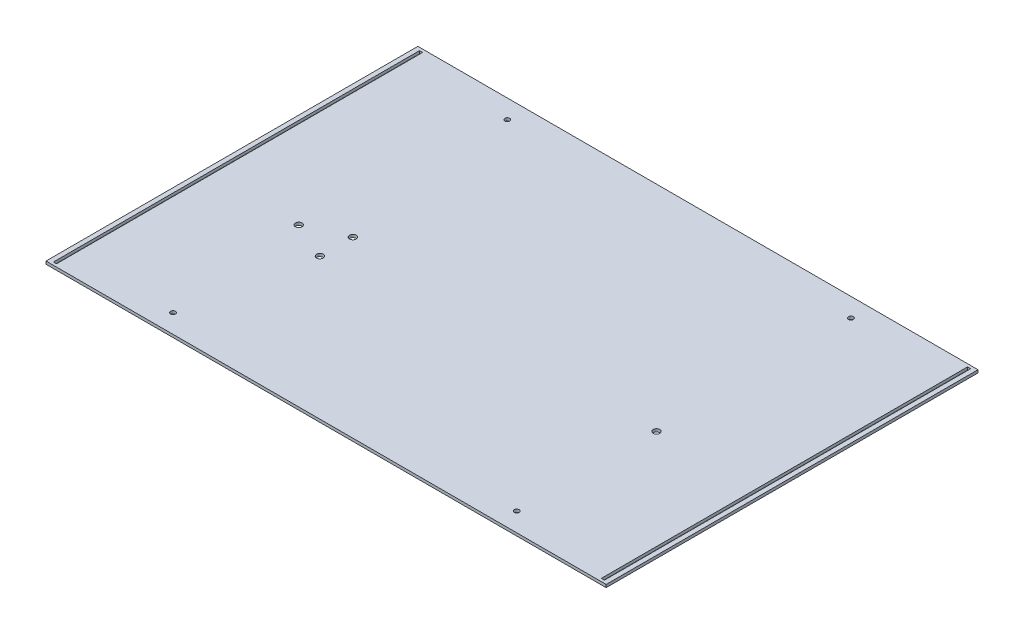
ISO-10303-21;
HEADER;
FILE_DESCRIPTION(('STEP AP214'),'2;1');
FILE_NAME('part.step','',(''),(''),'','','');
FILE_SCHEMA(('AUTOMOTIVE_DESIGN { 1 0 10303 214 1 1 1 1 }'));
ENDSEC;
DATA;
#1=APPLICATION_CONTEXT('core data for automotive mechanical design processes');
#2=APPLICATION_PROTOCOL_DEFINITION('international standard','automotive_design',2000,#1);
#3=PRODUCT_CONTEXT('',#1,'mechanical');
#4=PRODUCT('Part','Part','',(#3));
#5=PRODUCT_RELATED_PRODUCT_CATEGORY('part','',(#4));
#6=PRODUCT_DEFINITION_FORMATION('','',#4);
#7=PRODUCT_DEFINITION_CONTEXT('part definition',#1,'design');
#8=PRODUCT_DEFINITION('design','',#6,#7);
#9=PRODUCT_DEFINITION_SHAPE('','',#8);
#10=(LENGTH_UNIT() NAMED_UNIT(*) SI_UNIT(.MILLI.,.METRE.));
#11=(NAMED_UNIT(*) PLANE_ANGLE_UNIT() SI_UNIT($,.RADIAN.));
#12=(NAMED_UNIT(*) SI_UNIT($,.STERADIAN.) SOLID_ANGLE_UNIT());
#13=UNCERTAINTY_MEASURE_WITH_UNIT(LENGTH_MEASURE(1.E-05),#10,'distance_accuracy_value','');
#14=(GEOMETRIC_REPRESENTATION_CONTEXT(3) GLOBAL_UNCERTAINTY_ASSIGNED_CONTEXT((#13)) GLOBAL_UNIT_ASSIGNED_CONTEXT((#10,
#11,#12)) REPRESENTATION_CONTEXT('',''));
#15=CARTESIAN_POINT('',(0.,0.,0.));
#16=DIRECTION('',(0.,0.,1.));
#17=DIRECTION('',(1.,0.,0.));
#18=AXIS2_PLACEMENT_3D('',#15,#16,#17);
#19=CARTESIAN_POINT('',(297.5,3.,-197.5));
#20=DIRECTION('',(-1.,0.,0.));
#21=DIRECTION('',(0.,0.,1.));
#22=AXIS2_PLACEMENT_3D('',#19,#20,#21);
#23=PLANE('',#22);
#24=DIRECTION('',(0.,0.,-1.));
#25=VECTOR('',#24,1.);
#26=CARTESIAN_POINT('',(297.5,0.,-197.5));
#27=LINE('',#26,#25);
#28=CARTESIAN_POINT('',(297.5,0.,197.5));
#29=VERTEX_POINT('',#28);
#30=CARTESIAN_POINT('',(297.5,0.,-197.5));
#31=VERTEX_POINT('',#30);
#32=EDGE_CURVE('E224',#29,#31,#27,.T.);
#33=ORIENTED_EDGE('',*,*,#32,.T.);
#34=DIRECTION('',(0.,-1.,0.));
#35=VECTOR('',#34,1.);
#36=CARTESIAN_POINT('',(297.5,3.,-197.5));
#37=LINE('',#36,#35);
#38=CARTESIAN_POINT('',(297.5,3.,-197.5));
#39=VERTEX_POINT('',#38);
#40=EDGE_CURVE('E11',#39,#31,#37,.T.);
#41=ORIENTED_EDGE('',*,*,#40,.F.);
#42=DIRECTION('',(0.,0.,-1.));
#43=VECTOR('',#42,1.);
#44=CARTESIAN_POINT('',(297.5,3.,-197.5));
#45=LINE('',#44,#43);
#46=CARTESIAN_POINT('',(297.5,3.,197.5));
#47=VERTEX_POINT('',#46);
#48=EDGE_CURVE('E225',#47,#39,#45,.T.);
#49=ORIENTED_EDGE('',*,*,#48,.F.);
#50=DIRECTION('',(0.,-1.,0.));
#51=VECTOR('',#50,1.);
#52=CARTESIAN_POINT('',(297.5,3.,197.5));
#53=LINE('',#52,#51);
#54=EDGE_CURVE('E235',#47,#29,#53,.T.);
#55=ORIENTED_EDGE('',*,*,#54,.T.);
#56=EDGE_LOOP('',(#33,#41,#49,#55));
#57=FACE_BOUND('',#56,.T.);
#58=ADVANCED_FACE('F38',(#57),#23,.F.);
#59=CARTESIAN_POINT('',(-297.5,3.,-197.5));
#60=DIRECTION('',(0.,0.,1.));
#61=DIRECTION('',(1.,0.,0.));
#62=AXIS2_PLACEMENT_3D('',#59,#60,#61);
#63=PLANE('',#62);
#64=DIRECTION('',(-1.,0.,0.));
#65=VECTOR('',#64,1.);
#66=CARTESIAN_POINT('',(-297.5,0.,-197.5));
#67=LINE('',#66,#65);
#68=CARTESIAN_POINT('',(-297.5,0.,-197.5));
#69=VERTEX_POINT('',#68);
#70=EDGE_CURVE('E238',#31,#69,#67,.T.);
#71=ORIENTED_EDGE('',*,*,#70,.T.);
#72=DIRECTION('',(0.,-1.,0.));
#73=VECTOR('',#72,1.);
#74=CARTESIAN_POINT('',(-297.5,3.,-197.5));
#75=LINE('',#74,#73);
#76=CARTESIAN_POINT('',(-297.5,3.,-197.5));
#77=VERTEX_POINT('',#76);
#78=EDGE_CURVE('E46',#77,#69,#75,.T.);
#79=ORIENTED_EDGE('',*,*,#78,.F.);
#80=DIRECTION('',(-1.,0.,0.));
#81=VECTOR('',#80,1.);
#82=CARTESIAN_POINT('',(-297.5,3.,-197.5));
#83=LINE('',#82,#81);
#84=EDGE_CURVE('E228',#39,#77,#83,.T.);
#85=ORIENTED_EDGE('',*,*,#84,.F.);
#86=ORIENTED_EDGE('',*,*,#40,.T.);
#87=EDGE_LOOP('',(#71,#79,#85,#86));
#88=FACE_BOUND('',#87,.T.);
#89=ADVANCED_FACE('F277',(#88),#63,.F.);
#90=CARTESIAN_POINT('',(-297.5,3.,-197.5));
#91=DIRECTION('',(1.,0.,0.));
#92=DIRECTION('',(0.,0.,-1.));
#93=AXIS2_PLACEMENT_3D('',#90,#91,#92);
#94=PLANE('',#93);
#95=DIRECTION('',(0.,0.,1.));
#96=VECTOR('',#95,1.);
#97=CARTESIAN_POINT('',(-297.5,0.,-197.5));
#98=LINE('',#97,#96);
#99=CARTESIAN_POINT('',(-297.5,0.,197.5));
#100=VERTEX_POINT('',#99);
#101=EDGE_CURVE('E240',#69,#100,#98,.T.);
#102=ORIENTED_EDGE('',*,*,#101,.T.);
#103=DIRECTION('',(0.,-1.,0.));
#104=VECTOR('',#103,1.);
#105=CARTESIAN_POINT('',(-297.5,3.,197.5));
#106=LINE('',#105,#104);
#107=CARTESIAN_POINT('',(-297.5,3.,197.5));
#108=VERTEX_POINT('',#107);
#109=EDGE_CURVE('E245',#108,#100,#106,.T.);
#110=ORIENTED_EDGE('',*,*,#109,.F.);
#111=DIRECTION('',(0.,0.,1.));
#112=VECTOR('',#111,1.);
#113=CARTESIAN_POINT('',(-297.5,3.,-197.5));
#114=LINE('',#113,#112);
#115=EDGE_CURVE('E231',#77,#108,#114,.T.);
#116=ORIENTED_EDGE('',*,*,#115,.F.);
#117=ORIENTED_EDGE('',*,*,#78,.T.);
#118=EDGE_LOOP('',(#102,#110,#116,#117));
#119=FACE_BOUND('',#118,.T.);
#120=ADVANCED_FACE('F282',(#119),#94,.F.);
#121=CARTESIAN_POINT('',(-297.5,3.,197.5));
#122=DIRECTION('',(0.,0.,-1.));
#123=DIRECTION('',(-1.,0.,0.));
#124=AXIS2_PLACEMENT_3D('',#121,#122,#123);
#125=PLANE('',#124);
#126=DIRECTION('',(1.,0.,0.));
#127=VECTOR('',#126,1.);
#128=CARTESIAN_POINT('',(-297.5,0.,197.5));
#129=LINE('',#128,#127);
#130=EDGE_CURVE('E229',#100,#29,#129,.T.);
#131=ORIENTED_EDGE('',*,*,#130,.T.);
#132=ORIENTED_EDGE('',*,*,#54,.F.);
#133=DIRECTION('',(1.,0.,0.));
#134=VECTOR('',#133,1.);
#135=CARTESIAN_POINT('',(-297.5,3.,197.5));
#136=LINE('',#135,#134);
#137=EDGE_CURVE('E233',#108,#47,#136,.T.);
#138=ORIENTED_EDGE('',*,*,#137,.F.);
#139=ORIENTED_EDGE('',*,*,#109,.T.);
#140=EDGE_LOOP('',(#131,#132,#138,#139));
#141=FACE_BOUND('',#140,.T.);
#142=ADVANCED_FACE('F298',(#141),#125,.F.);
#143=CARTESIAN_POINT('',(0.,3.,0.));
#144=DIRECTION('',(0.,1.,0.));
#145=DIRECTION('',(0.,0.,1.));
#146=AXIS2_PLACEMENT_3D('',#143,#144,#145);
#147=PLANE('',#146);
#148=CARTESIAN_POINT('',(182.5,3.,-177.5));
#149=DIRECTION('',(0.,-1.,0.));
#150=DIRECTION('',(0.,0.,-1.));
#151=AXIS2_PLACEMENT_3D('',#148,#149,#150);
#152=CIRCLE('',#151,2.59999999999999);
#153=CARTESIAN_POINT('',(182.5,3.,-180.1));
#154=VERTEX_POINT('',#153);
#155=EDGE_CURVE('E375',#154,#154,#152,.T.);
#156=ORIENTED_EDGE('',*,*,#155,.T.);
#157=EDGE_LOOP('',(#156));
#158=FACE_BOUND('',#157,.T.);
#159=CARTESIAN_POINT('',(-182.5,3.,-177.5));
#160=DIRECTION('',(0.,-1.,0.));
#161=DIRECTION('',(0.,0.,-1.));
#162=AXIS2_PLACEMENT_3D('',#159,#160,#161);
#163=CIRCLE('',#162,2.59999999999999);
#164=CARTESIAN_POINT('',(-182.5,3.,-180.1));
#165=VERTEX_POINT('',#164);
#166=EDGE_CURVE('E370',#165,#165,#163,.T.);
#167=ORIENTED_EDGE('',*,*,#166,.T.);
#168=EDGE_LOOP('',(#167));
#169=FACE_BOUND('',#168,.T.);
#170=CARTESIAN_POINT('',(-182.5,3.,177.5));
#171=DIRECTION('',(0.,-1.,0.));
#172=DIRECTION('',(0.,0.,-1.));
#173=AXIS2_PLACEMENT_3D('',#170,#171,#172);
#174=CIRCLE('',#173,2.59999999999999);
#175=CARTESIAN_POINT('',(-182.5,3.,174.9));
#176=VERTEX_POINT('',#175);
#177=EDGE_CURVE('E368',#176,#176,#174,.T.);
#178=ORIENTED_EDGE('',*,*,#177,.T.);
#179=EDGE_LOOP('',(#178));
#180=FACE_BOUND('',#179,.T.);
#181=CARTESIAN_POINT('',(182.5,3.,177.5));
#182=DIRECTION('',(0.,-1.,0.));
#183=DIRECTION('',(0.,0.,-1.));
#184=AXIS2_PLACEMENT_3D('',#181,#182,#183);
#185=CIRCLE('',#184,2.59999999999999);
#186=CARTESIAN_POINT('',(182.5,3.,174.9));
#187=VERTEX_POINT('',#186);
#188=EDGE_CURVE('E156',#187,#187,#185,.T.);
#189=ORIENTED_EDGE('',*,*,#188,.T.);
#190=EDGE_LOOP('',(#189));
#191=FACE_BOUND('',#190,.T.);
#192=DIRECTION('',(0.,0.,1.));
#193=VECTOR('',#192,1.);
#194=CARTESIAN_POINT('',(289.350000000001,3.,0.));
#195=LINE('',#194,#193);
#196=CARTESIAN_POINT('',(289.350000000001,3.,-194.499999999999));
#197=VERTEX_POINT('',#196);
#198=CARTESIAN_POINT('',(289.350000000001,3.,194.500000000001));
#199=VERTEX_POINT('',#198);
#200=EDGE_CURVE('E133',#197,#199,#195,.T.);
#201=ORIENTED_EDGE('',*,*,#200,.F.);
#202=DIRECTION('',(-1.,0.,0.));
#203=VECTOR('',#202,1.);
#204=CARTESIAN_POINT('',(0.,3.,-194.499999999999));
#205=LINE('',#204,#203);
#206=CARTESIAN_POINT('',(292.650000000001,3.,-194.499999999999));
#207=VERTEX_POINT('',#206);
#208=EDGE_CURVE('E197',#207,#197,#205,.T.);
#209=ORIENTED_EDGE('',*,*,#208,.F.);
#210=DIRECTION('',(0.,0.,-1.));
#211=VECTOR('',#210,1.);
#212=CARTESIAN_POINT('',(292.650000000001,3.,0.));
#213=LINE('',#212,#211);
#214=CARTESIAN_POINT('',(292.650000000001,3.,194.500000000001));
#215=VERTEX_POINT('',#214);
#216=EDGE_CURVE('E195',#215,#207,#213,.T.);
#217=ORIENTED_EDGE('',*,*,#216,.F.);
#218=DIRECTION('',(1.,0.,0.));
#219=VECTOR('',#218,1.);
#220=CARTESIAN_POINT('',(0.,3.,194.500000000001));
#221=LINE('',#220,#219);
#222=EDGE_CURVE('E193',#199,#215,#221,.T.);
#223=ORIENTED_EDGE('',*,*,#222,.F.);
#224=EDGE_LOOP('',(#201,#209,#217,#223));
#225=FACE_BOUND('',#224,.T.);
#226=DIRECTION('',(0.,0.,-1.));
#227=VECTOR('',#226,1.);
#228=CARTESIAN_POINT('',(-289.35,3.,0.));
#229=LINE('',#228,#227);
#230=CARTESIAN_POINT('',(-289.35,3.,194.5));
#231=VERTEX_POINT('',#230);
#232=CARTESIAN_POINT('',(-289.35,3.,-194.5));
#233=VERTEX_POINT('',#232);
#234=EDGE_CURVE('E191',#231,#233,#229,.T.);
#235=ORIENTED_EDGE('',*,*,#234,.F.);
#236=DIRECTION('',(1.,0.,0.));
#237=VECTOR('',#236,1.);
#238=CARTESIAN_POINT('',(0.,3.,194.5));
#239=LINE('',#238,#237);
#240=CARTESIAN_POINT('',(-292.65,3.,194.5));
#241=VERTEX_POINT('',#240);
#242=EDGE_CURVE('E189',#241,#231,#239,.T.);
#243=ORIENTED_EDGE('',*,*,#242,.F.);
#244=DIRECTION('',(0.,0.,1.));
#245=VECTOR('',#244,1.);
#246=CARTESIAN_POINT('',(-292.65,3.,0.));
#247=LINE('',#246,#245);
#248=CARTESIAN_POINT('',(-292.65,3.,-194.5));
#249=VERTEX_POINT('',#248);
#250=EDGE_CURVE('E187',#249,#241,#247,.T.);
#251=ORIENTED_EDGE('',*,*,#250,.F.);
#252=DIRECTION('',(-1.,0.,0.));
#253=VECTOR('',#252,1.);
#254=CARTESIAN_POINT('',(0.,3.,-194.5));
#255=LINE('',#254,#253);
#256=EDGE_CURVE('E163',#233,#249,#255,.T.);
#257=ORIENTED_EDGE('',*,*,#256,.F.);
#258=EDGE_LOOP('',(#235,#243,#251,#257));
#259=FACE_BOUND('',#258,.T.);
#260=CARTESIAN_POINT('',(-196.5,3.,30.));
#261=DIRECTION('',(0.,1.,0.));
#262=DIRECTION('',(0.,0.,1.));
#263=AXIS2_PLACEMENT_3D('',#260,#261,#262);
#264=CIRCLE('',#263,3.54999999999999);
#265=CARTESIAN_POINT('',(-196.5,3.,33.55));
#266=VERTEX_POINT('',#265);
#267=EDGE_CURVE('E221',#266,#266,#264,.T.);
#268=ORIENTED_EDGE('',*,*,#267,.F.);
#269=EDGE_LOOP('',(#268));
#270=FACE_BOUND('',#269,.T.);
#271=CARTESIAN_POINT('',(-156.5,3.,47.4999999999998));
#272=DIRECTION('',(0.,1.,0.));
#273=DIRECTION('',(0.,0.,1.));
#274=AXIS2_PLACEMENT_3D('',#271,#272,#273);
#275=CIRCLE('',#274,3.54999999999999);
#276=CARTESIAN_POINT('',(-156.5,3.,51.0499999999998));
#277=VERTEX_POINT('',#276);
#278=EDGE_CURVE('E218',#277,#277,#275,.T.);
#279=ORIENTED_EDGE('',*,*,#278,.F.);
#280=EDGE_LOOP('',(#279));
#281=FACE_BOUND('',#280,.T.);
#282=CARTESIAN_POINT('',(-156.5,3.,12.4999999999998));
#283=DIRECTION('',(0.,1.,0.));
#284=DIRECTION('',(0.,0.,1.));
#285=AXIS2_PLACEMENT_3D('',#282,#283,#284);
#286=CIRCLE('',#285,3.54999999999999);
#287=CARTESIAN_POINT('',(-156.5,3.,16.0499999999998));
#288=VERTEX_POINT('',#287);
#289=EDGE_CURVE('E215',#288,#288,#286,.T.);
#290=ORIENTED_EDGE('',*,*,#289,.F.);
#291=EDGE_LOOP('',(#290));
#292=FACE_BOUND('',#291,.T.);
#293=CARTESIAN_POINT('',(183.5,3.,30.0000000000084));
#294=DIRECTION('',(0.,1.,0.));
#295=DIRECTION('',(0.,0.,1.));
#296=AXIS2_PLACEMENT_3D('',#293,#294,#295);
#297=CIRCLE('',#296,3.54999999999999);
#298=CARTESIAN_POINT('',(183.5,3.,33.5500000000084));
#299=VERTEX_POINT('',#298);
#300=EDGE_CURVE('E204',#299,#299,#297,.T.);
#301=ORIENTED_EDGE('',*,*,#300,.F.);
#302=EDGE_LOOP('',(#301));
#303=FACE_BOUND('',#302,.T.);
#304=ORIENTED_EDGE('',*,*,#48,.T.);
#305=ORIENTED_EDGE('',*,*,#84,.T.);
#306=ORIENTED_EDGE('',*,*,#115,.T.);
#307=ORIENTED_EDGE('',*,*,#137,.T.);
#308=EDGE_LOOP('',(#304,#305,#306,#307));
#309=FACE_BOUND('',#308,.T.);
#310=ADVANCED_FACE('F294',(#158,#169,#180,#191,#225,#259,#270,#281,#292,#303,#309),#147,.T.);
#311=CARTESIAN_POINT('',(0.,0.,0.));
#312=DIRECTION('',(0.,1.,0.));
#313=DIRECTION('',(0.,0.,1.));
#314=AXIS2_PLACEMENT_3D('',#311,#312,#313);
#315=PLANE('',#314);
#316=CARTESIAN_POINT('',(182.5,0.,-177.5));
#317=DIRECTION('',(0.,1.,0.));
#318=DIRECTION('',(0.,0.,1.));
#319=AXIS2_PLACEMENT_3D('',#316,#317,#318);
#320=CIRCLE('',#319,2.59999999999999);
#321=CARTESIAN_POINT('',(182.5,0.,-174.9));
#322=VERTEX_POINT('',#321);
#323=EDGE_CURVE('E41',#322,#322,#320,.T.);
#324=ORIENTED_EDGE('',*,*,#323,.T.);
#325=EDGE_LOOP('',(#324));
#326=FACE_BOUND('',#325,.T.);
#327=CARTESIAN_POINT('',(-182.5,0.,-177.5));
#328=DIRECTION('',(0.,1.,0.));
#329=DIRECTION('',(0.,0.,1.));
#330=AXIS2_PLACEMENT_3D('',#327,#328,#329);
#331=CIRCLE('',#330,2.59999999999999);
#332=CARTESIAN_POINT('',(-182.5,0.,-174.9));
#333=VERTEX_POINT('',#332);
#334=EDGE_CURVE('E255',#333,#333,#331,.T.);
#335=ORIENTED_EDGE('',*,*,#334,.T.);
#336=EDGE_LOOP('',(#335));
#337=FACE_BOUND('',#336,.T.);
#338=CARTESIAN_POINT('',(-182.5,0.,177.5));
#339=DIRECTION('',(0.,1.,0.));
#340=DIRECTION('',(0.,0.,1.));
#341=AXIS2_PLACEMENT_3D('',#338,#339,#340);
#342=CIRCLE('',#341,2.59999999999999);
#343=CARTESIAN_POINT('',(-182.5,0.,180.1));
#344=VERTEX_POINT('',#343);
#345=EDGE_CURVE('E253',#344,#344,#342,.T.);
#346=ORIENTED_EDGE('',*,*,#345,.T.);
#347=EDGE_LOOP('',(#346));
#348=FACE_BOUND('',#347,.T.);
#349=CARTESIAN_POINT('',(182.5,0.,177.5));
#350=DIRECTION('',(0.,1.,0.));
#351=DIRECTION('',(0.,0.,1.));
#352=AXIS2_PLACEMENT_3D('',#349,#350,#351);
#353=CIRCLE('',#352,2.59999999999999);
#354=CARTESIAN_POINT('',(182.5,0.,180.1));
#355=VERTEX_POINT('',#354);
#356=EDGE_CURVE('E250',#355,#355,#353,.T.);
#357=ORIENTED_EDGE('',*,*,#356,.T.);
#358=EDGE_LOOP('',(#357));
#359=FACE_BOUND('',#358,.T.);
#360=DIRECTION('',(-1.,0.,0.));
#361=VECTOR('',#360,1.);
#362=CARTESIAN_POINT('',(292.650000000001,0.,-194.499999999999));
#363=LINE('',#362,#361);
#364=CARTESIAN_POINT('',(292.650000000001,0.,-194.499999999999));
#365=VERTEX_POINT('',#364);
#366=CARTESIAN_POINT('',(289.350000000001,0.,-194.499999999999));
#367=VERTEX_POINT('',#366);
#368=EDGE_CURVE('E136',#365,#367,#363,.T.);
#369=ORIENTED_EDGE('',*,*,#368,.T.);
#370=DIRECTION('',(0.,0.,1.));
#371=VECTOR('',#370,1.);
#372=CARTESIAN_POINT('',(289.350000000001,0.,194.500000000001));
#373=LINE('',#372,#371);
#374=CARTESIAN_POINT('',(289.350000000001,0.,194.500000000001));
#375=VERTEX_POINT('',#374);
#376=EDGE_CURVE('E130',#367,#375,#373,.T.);
#377=ORIENTED_EDGE('',*,*,#376,.T.);
#378=DIRECTION('',(1.,0.,0.));
#379=VECTOR('',#378,1.);
#380=CARTESIAN_POINT('',(292.650000000001,0.,194.500000000001));
#381=LINE('',#380,#379);
#382=CARTESIAN_POINT('',(292.650000000001,0.,194.500000000001));
#383=VERTEX_POINT('',#382);
#384=EDGE_CURVE('E140',#375,#383,#381,.T.);
#385=ORIENTED_EDGE('',*,*,#384,.T.);
#386=DIRECTION('',(0.,0.,-1.));
#387=VECTOR('',#386,1.);
#388=CARTESIAN_POINT('',(292.650000000001,0.,194.500000000001));
#389=LINE('',#388,#387);
#390=EDGE_CURVE('E145',#383,#365,#389,.T.);
#391=ORIENTED_EDGE('',*,*,#390,.T.);
#392=EDGE_LOOP('',(#369,#377,#385,#391));
#393=FACE_BOUND('',#392,.T.);
#394=DIRECTION('',(1.,0.,0.));
#395=VECTOR('',#394,1.);
#396=CARTESIAN_POINT('',(-292.65,0.,194.5));
#397=LINE('',#396,#395);
#398=CARTESIAN_POINT('',(-292.65,0.,194.5));
#399=VERTEX_POINT('',#398);
#400=CARTESIAN_POINT('',(-289.35,0.,194.5));
#401=VERTEX_POINT('',#400);
#402=EDGE_CURVE('E177',#399,#401,#397,.T.);
#403=ORIENTED_EDGE('',*,*,#402,.T.);
#404=DIRECTION('',(0.,0.,-1.));
#405=VECTOR('',#404,1.);
#406=CARTESIAN_POINT('',(-289.35,0.,194.5));
#407=LINE('',#406,#405);
#408=CARTESIAN_POINT('',(-289.35,0.,-194.5));
#409=VERTEX_POINT('',#408);
#410=EDGE_CURVE('E168',#401,#409,#407,.T.);
#411=ORIENTED_EDGE('',*,*,#410,.T.);
#412=DIRECTION('',(-1.,0.,0.));
#413=VECTOR('',#412,1.);
#414=CARTESIAN_POINT('',(-292.65,0.,-194.5));
#415=LINE('',#414,#413);
#416=CARTESIAN_POINT('',(-292.65,0.,-194.5));
#417=VERTEX_POINT('',#416);
#418=EDGE_CURVE('E171',#409,#417,#415,.T.);
#419=ORIENTED_EDGE('',*,*,#418,.T.);
#420=DIRECTION('',(0.,0.,1.));
#421=VECTOR('',#420,1.);
#422=CARTESIAN_POINT('',(-292.65,0.,194.5));
#423=LINE('',#422,#421);
#424=EDGE_CURVE('E174',#417,#399,#423,.T.);
#425=ORIENTED_EDGE('',*,*,#424,.T.);
#426=EDGE_LOOP('',(#403,#411,#419,#425));
#427=FACE_BOUND('',#426,.T.);
#428=CARTESIAN_POINT('',(-196.5,0.,30.));
#429=DIRECTION('',(0.,1.,0.));
#430=DIRECTION('',(0.,0.,1.));
#431=AXIS2_PLACEMENT_3D('',#428,#429,#430);
#432=CIRCLE('',#431,3.54999999999999);
#433=CARTESIAN_POINT('',(-196.5,0.,33.55));
#434=VERTEX_POINT('',#433);
#435=EDGE_CURVE('E201',#434,#434,#432,.T.);
#436=ORIENTED_EDGE('',*,*,#435,.T.);
#437=EDGE_LOOP('',(#436));
#438=FACE_BOUND('',#437,.T.);
#439=CARTESIAN_POINT('',(-156.5,0.,47.4999999999998));
#440=DIRECTION('',(0.,1.,0.));
#441=DIRECTION('',(0.,0.,1.));
#442=AXIS2_PLACEMENT_3D('',#439,#440,#441);
#443=CIRCLE('',#442,3.54999999999999);
#444=CARTESIAN_POINT('',(-156.5,0.,51.0499999999998));
#445=VERTEX_POINT('',#444);
#446=EDGE_CURVE('E205',#445,#445,#443,.T.);
#447=ORIENTED_EDGE('',*,*,#446,.T.);
#448=EDGE_LOOP('',(#447));
#449=FACE_BOUND('',#448,.T.);
#450=CARTESIAN_POINT('',(-156.5,0.,12.4999999999998));
#451=DIRECTION('',(0.,1.,0.));
#452=DIRECTION('',(0.,0.,1.));
#453=AXIS2_PLACEMENT_3D('',#450,#451,#452);
#454=CIRCLE('',#453,3.54999999999999);
#455=CARTESIAN_POINT('',(-156.5,0.,16.0499999999998));
#456=VERTEX_POINT('',#455);
#457=EDGE_CURVE('E208',#456,#456,#454,.T.);
#458=ORIENTED_EDGE('',*,*,#457,.T.);
#459=EDGE_LOOP('',(#458));
#460=FACE_BOUND('',#459,.T.);
#461=CARTESIAN_POINT('',(183.5,0.,30.0000000000084));
#462=DIRECTION('',(0.,1.,0.));
#463=DIRECTION('',(0.,0.,1.));
#464=AXIS2_PLACEMENT_3D('',#461,#462,#463);
#465=CIRCLE('',#464,3.54999999999999);
#466=CARTESIAN_POINT('',(183.5,0.,33.5500000000084));
#467=VERTEX_POINT('',#466);
#468=EDGE_CURVE('E200',#467,#467,#465,.T.);
#469=ORIENTED_EDGE('',*,*,#468,.T.);
#470=EDGE_LOOP('',(#469));
#471=FACE_BOUND('',#470,.T.);
#472=ORIENTED_EDGE('',*,*,#32,.F.);
#473=ORIENTED_EDGE('',*,*,#130,.F.);
#474=ORIENTED_EDGE('',*,*,#101,.F.);
#475=ORIENTED_EDGE('',*,*,#70,.F.);
#476=EDGE_LOOP('',(#472,#473,#474,#475));
#477=FACE_BOUND('',#476,.T.);
#478=ADVANCED_FACE('F147',(#326,#337,#348,#359,#393,#427,#438,#449,#460,#471,#477),#315,.F.);
#479=CARTESIAN_POINT('',(183.5,0.,30.0000000000084));
#480=DIRECTION('',(0.,1.,0.));
#481=DIRECTION('',(0.,0.,1.));
#482=AXIS2_PLACEMENT_3D('',#479,#480,#481);
#483=CYLINDRICAL_SURFACE('',#482,3.54999999999999);
#484=ORIENTED_EDGE('',*,*,#300,.T.);
#485=EDGE_LOOP('',(#484));
#486=FACE_BOUND('',#485,.T.);
#487=ORIENTED_EDGE('',*,*,#468,.F.);
#488=EDGE_LOOP('',(#487));
#489=FACE_BOUND('',#488,.T.);
#490=ADVANCED_FACE('F309',(#486,#489),#483,.F.);
#491=CARTESIAN_POINT('',(-156.5,0.,12.4999999999998));
#492=DIRECTION('',(0.,1.,0.));
#493=DIRECTION('',(0.,0.,1.));
#494=AXIS2_PLACEMENT_3D('',#491,#492,#493);
#495=CYLINDRICAL_SURFACE('',#494,3.54999999999999);
#496=ORIENTED_EDGE('',*,*,#289,.T.);
#497=EDGE_LOOP('',(#496));
#498=FACE_BOUND('',#497,.T.);
#499=ORIENTED_EDGE('',*,*,#457,.F.);
#500=EDGE_LOOP('',(#499));
#501=FACE_BOUND('',#500,.T.);
#502=ADVANCED_FACE('F315',(#498,#501),#495,.F.);
#503=CARTESIAN_POINT('',(-156.5,0.,47.4999999999998));
#504=DIRECTION('',(0.,1.,0.));
#505=DIRECTION('',(0.,0.,1.));
#506=AXIS2_PLACEMENT_3D('',#503,#504,#505);
#507=CYLINDRICAL_SURFACE('',#506,3.54999999999999);
#508=ORIENTED_EDGE('',*,*,#278,.T.);
#509=EDGE_LOOP('',(#508));
#510=FACE_BOUND('',#509,.T.);
#511=ORIENTED_EDGE('',*,*,#446,.F.);
#512=EDGE_LOOP('',(#511));
#513=FACE_BOUND('',#512,.T.);
#514=ADVANCED_FACE('F319',(#510,#513),#507,.F.);
#515=CARTESIAN_POINT('',(-196.5,0.,30.));
#516=DIRECTION('',(0.,1.,0.));
#517=DIRECTION('',(0.,0.,1.));
#518=AXIS2_PLACEMENT_3D('',#515,#516,#517);
#519=CYLINDRICAL_SURFACE('',#518,3.54999999999999);
#520=ORIENTED_EDGE('',*,*,#267,.T.);
#521=EDGE_LOOP('',(#520));
#522=FACE_BOUND('',#521,.T.);
#523=ORIENTED_EDGE('',*,*,#435,.F.);
#524=EDGE_LOOP('',(#523));
#525=FACE_BOUND('',#524,.T.);
#526=ADVANCED_FACE('F323',(#522,#525),#519,.F.);
#527=CARTESIAN_POINT('',(-289.35,0.,194.5));
#528=DIRECTION('',(1.,0.,0.));
#529=DIRECTION('',(0.,0.,-1.));
#530=AXIS2_PLACEMENT_3D('',#527,#528,#529);
#531=PLANE('',#530);
#532=ORIENTED_EDGE('',*,*,#234,.T.);
#533=DIRECTION('',(0.,1.,0.));
#534=VECTOR('',#533,1.);
#535=CARTESIAN_POINT('',(-289.35,0.,-194.5));
#536=LINE('',#535,#534);
#537=EDGE_CURVE('E62',#409,#233,#536,.T.);
#538=ORIENTED_EDGE('',*,*,#537,.F.);
#539=ORIENTED_EDGE('',*,*,#410,.F.);
#540=DIRECTION('',(0.,1.,0.));
#541=VECTOR('',#540,1.);
#542=CARTESIAN_POINT('',(-289.35,0.,194.5));
#543=LINE('',#542,#541);
#544=EDGE_CURVE('E150',#401,#231,#543,.T.);
#545=ORIENTED_EDGE('',*,*,#544,.T.);
#546=EDGE_LOOP('',(#532,#538,#539,#545));
#547=FACE_BOUND('',#546,.T.);
#548=ADVANCED_FACE('F327',(#547),#531,.F.);
#549=CARTESIAN_POINT('',(-292.65,0.,194.5));
#550=DIRECTION('',(0.,0.,1.));
#551=DIRECTION('',(1.,0.,0.));
#552=AXIS2_PLACEMENT_3D('',#549,#550,#551);
#553=PLANE('',#552);
#554=ORIENTED_EDGE('',*,*,#242,.T.);
#555=ORIENTED_EDGE('',*,*,#544,.F.);
#556=ORIENTED_EDGE('',*,*,#402,.F.);
#557=DIRECTION('',(0.,1.,0.));
#558=VECTOR('',#557,1.);
#559=CARTESIAN_POINT('',(-292.65,0.,194.5));
#560=LINE('',#559,#558);
#561=EDGE_CURVE('E153',#399,#241,#560,.T.);
#562=ORIENTED_EDGE('',*,*,#561,.T.);
#563=EDGE_LOOP('',(#554,#555,#556,#562));
#564=FACE_BOUND('',#563,.T.);
#565=ADVANCED_FACE('F331',(#564),#553,.F.);
#566=CARTESIAN_POINT('',(-292.65,0.,194.5));
#567=DIRECTION('',(-1.,0.,0.));
#568=DIRECTION('',(0.,0.,1.));
#569=AXIS2_PLACEMENT_3D('',#566,#567,#568);
#570=PLANE('',#569);
#571=ORIENTED_EDGE('',*,*,#250,.T.);
#572=ORIENTED_EDGE('',*,*,#561,.F.);
#573=ORIENTED_EDGE('',*,*,#424,.F.);
#574=DIRECTION('',(0.,1.,0.));
#575=VECTOR('',#574,1.);
#576=CARTESIAN_POINT('',(-292.65,0.,-194.5));
#577=LINE('',#576,#575);
#578=EDGE_CURVE('E182',#417,#249,#577,.T.);
#579=ORIENTED_EDGE('',*,*,#578,.T.);
#580=EDGE_LOOP('',(#571,#572,#573,#579));
#581=FACE_BOUND('',#580,.T.);
#582=ADVANCED_FACE('F336',(#581),#570,.F.);
#583=CARTESIAN_POINT('',(-292.65,0.,-194.5));
#584=DIRECTION('',(0.,0.,-1.));
#585=DIRECTION('',(-1.,0.,0.));
#586=AXIS2_PLACEMENT_3D('',#583,#584,#585);
#587=PLANE('',#586);
#588=ORIENTED_EDGE('',*,*,#256,.T.);
#589=ORIENTED_EDGE('',*,*,#578,.F.);
#590=ORIENTED_EDGE('',*,*,#418,.F.);
#591=ORIENTED_EDGE('',*,*,#537,.T.);
#592=EDGE_LOOP('',(#588,#589,#590,#591));
#593=FACE_BOUND('',#592,.T.);
#594=ADVANCED_FACE('F333',(#593),#587,.F.);
#595=CARTESIAN_POINT('',(289.350000000001,0.,194.500000000001));
#596=DIRECTION('',(-1.,0.,0.));
#597=DIRECTION('',(0.,0.,1.));
#598=AXIS2_PLACEMENT_3D('',#595,#596,#597);
#599=PLANE('',#598);
#600=ORIENTED_EDGE('',*,*,#200,.T.);
#601=DIRECTION('',(0.,1.,0.));
#602=VECTOR('',#601,1.);
#603=CARTESIAN_POINT('',(289.350000000001,0.,194.500000000001));
#604=LINE('',#603,#602);
#605=EDGE_CURVE('E54',#375,#199,#604,.T.);
#606=ORIENTED_EDGE('',*,*,#605,.F.);
#607=ORIENTED_EDGE('',*,*,#376,.F.);
#608=DIRECTION('',(0.,1.,0.));
#609=VECTOR('',#608,1.);
#610=CARTESIAN_POINT('',(289.350000000001,0.,-194.499999999999));
#611=LINE('',#610,#609);
#612=EDGE_CURVE('E161',#367,#197,#611,.T.);
#613=ORIENTED_EDGE('',*,*,#612,.T.);
#614=EDGE_LOOP('',(#600,#606,#607,#613));
#615=FACE_BOUND('',#614,.T.);
#616=ADVANCED_FACE('F127',(#615),#599,.F.);
#617=CARTESIAN_POINT('',(292.650000000001,0.,-194.499999999999));
#618=DIRECTION('',(0.,0.,-1.));
#619=DIRECTION('',(-1.,0.,0.));
#620=AXIS2_PLACEMENT_3D('',#617,#618,#619);
#621=PLANE('',#620);
#622=ORIENTED_EDGE('',*,*,#208,.T.);
#623=ORIENTED_EDGE('',*,*,#612,.F.);
#624=ORIENTED_EDGE('',*,*,#368,.F.);
#625=DIRECTION('',(0.,1.,0.));
#626=VECTOR('',#625,1.);
#627=CARTESIAN_POINT('',(292.650000000001,0.,-194.499999999999));
#628=LINE('',#627,#626);
#629=EDGE_CURVE('E164',#365,#207,#628,.T.);
#630=ORIENTED_EDGE('',*,*,#629,.T.);
#631=EDGE_LOOP('',(#622,#623,#624,#630));
#632=FACE_BOUND('',#631,.T.);
#633=ADVANCED_FACE('F345',(#632),#621,.F.);
#634=CARTESIAN_POINT('',(292.650000000001,0.,194.500000000001));
#635=DIRECTION('',(1.,0.,0.));
#636=DIRECTION('',(0.,0.,-1.));
#637=AXIS2_PLACEMENT_3D('',#634,#635,#636);
#638=PLANE('',#637);
#639=ORIENTED_EDGE('',*,*,#216,.T.);
#640=ORIENTED_EDGE('',*,*,#629,.F.);
#641=ORIENTED_EDGE('',*,*,#390,.F.);
#642=DIRECTION('',(0.,1.,0.));
#643=VECTOR('',#642,1.);
#644=CARTESIAN_POINT('',(292.650000000001,0.,194.500000000001));
#645=LINE('',#644,#643);
#646=EDGE_CURVE('E135',#383,#215,#645,.T.);
#647=ORIENTED_EDGE('',*,*,#646,.T.);
#648=EDGE_LOOP('',(#639,#640,#641,#647));
#649=FACE_BOUND('',#648,.T.);
#650=ADVANCED_FACE('F349',(#649),#638,.F.);
#651=CARTESIAN_POINT('',(292.650000000001,0.,194.500000000001));
#652=DIRECTION('',(0.,0.,1.));
#653=DIRECTION('',(1.,0.,0.));
#654=AXIS2_PLACEMENT_3D('',#651,#652,#653);
#655=PLANE('',#654);
#656=ORIENTED_EDGE('',*,*,#222,.T.);
#657=ORIENTED_EDGE('',*,*,#646,.F.);
#658=ORIENTED_EDGE('',*,*,#384,.F.);
#659=ORIENTED_EDGE('',*,*,#605,.T.);
#660=EDGE_LOOP('',(#656,#657,#658,#659));
#661=FACE_BOUND('',#660,.T.);
#662=ADVANCED_FACE('F141',(#661),#655,.F.);
#663=CARTESIAN_POINT('',(182.5,3.,177.5));
#664=DIRECTION('',(0.,-1.,0.));
#665=DIRECTION('',(0.,0.,-1.));
#666=AXIS2_PLACEMENT_3D('',#663,#664,#665);
#667=CYLINDRICAL_SURFACE('',#666,2.59999999999999);
#668=ORIENTED_EDGE('',*,*,#188,.F.);
#669=EDGE_LOOP('',(#668));
#670=FACE_BOUND('',#669,.T.);
#671=ORIENTED_EDGE('',*,*,#356,.F.);
#672=EDGE_LOOP('',(#671));
#673=FACE_BOUND('',#672,.T.);
#674=ADVANCED_FACE('F348',(#670,#673),#667,.F.);
#675=CARTESIAN_POINT('',(-182.5,3.,177.5));
#676=DIRECTION('',(0.,-1.,0.));
#677=DIRECTION('',(0.,0.,-1.));
#678=AXIS2_PLACEMENT_3D('',#675,#676,#677);
#679=CYLINDRICAL_SURFACE('',#678,2.59999999999999);
#680=ORIENTED_EDGE('',*,*,#177,.F.);
#681=EDGE_LOOP('',(#680));
#682=FACE_BOUND('',#681,.T.);
#683=ORIENTED_EDGE('',*,*,#345,.F.);
#684=EDGE_LOOP('',(#683));
#685=FACE_BOUND('',#684,.T.);
#686=ADVANCED_FACE('F271',(#682,#685),#679,.F.);
#687=CARTESIAN_POINT('',(-182.5,3.,-177.5));
#688=DIRECTION('',(0.,-1.,0.));
#689=DIRECTION('',(0.,0.,-1.));
#690=AXIS2_PLACEMENT_3D('',#687,#688,#689);
#691=CYLINDRICAL_SURFACE('',#690,2.59999999999999);
#692=ORIENTED_EDGE('',*,*,#166,.F.);
#693=EDGE_LOOP('',(#692));
#694=FACE_BOUND('',#693,.T.);
#695=ORIENTED_EDGE('',*,*,#334,.F.);
#696=EDGE_LOOP('',(#695));
#697=FACE_BOUND('',#696,.T.);
#698=ADVANCED_FACE('F265',(#694,#697),#691,.F.);
#699=CARTESIAN_POINT('',(182.5,3.,-177.5));
#700=DIRECTION('',(0.,-1.,0.));
#701=DIRECTION('',(0.,0.,-1.));
#702=AXIS2_PLACEMENT_3D('',#699,#700,#701);
#703=CYLINDRICAL_SURFACE('',#702,2.59999999999999);
#704=ORIENTED_EDGE('',*,*,#155,.F.);
#705=EDGE_LOOP('',(#704));
#706=FACE_BOUND('',#705,.T.);
#707=ORIENTED_EDGE('',*,*,#323,.F.);
#708=EDGE_LOOP('',(#707));
#709=FACE_BOUND('',#708,.T.);
#710=ADVANCED_FACE('F263',(#706,#709),#703,.F.);
#711=CLOSED_SHELL('',(#58,#89,#120,#142,#310,#478,#490,#502,#514,#526,#548,#565,#582,#594,#616,
#633,#650,#662,#674,#686,#698,#710));
#712=MANIFOLD_SOLID_BREP('B2',#711);
#713=ADVANCED_BREP_SHAPE_REPRESENTATION('',(#18,#712),#14);
#714=SHAPE_DEFINITION_REPRESENTATION(#9,#713);
ENDSEC;
END-ISO-10303-21;
